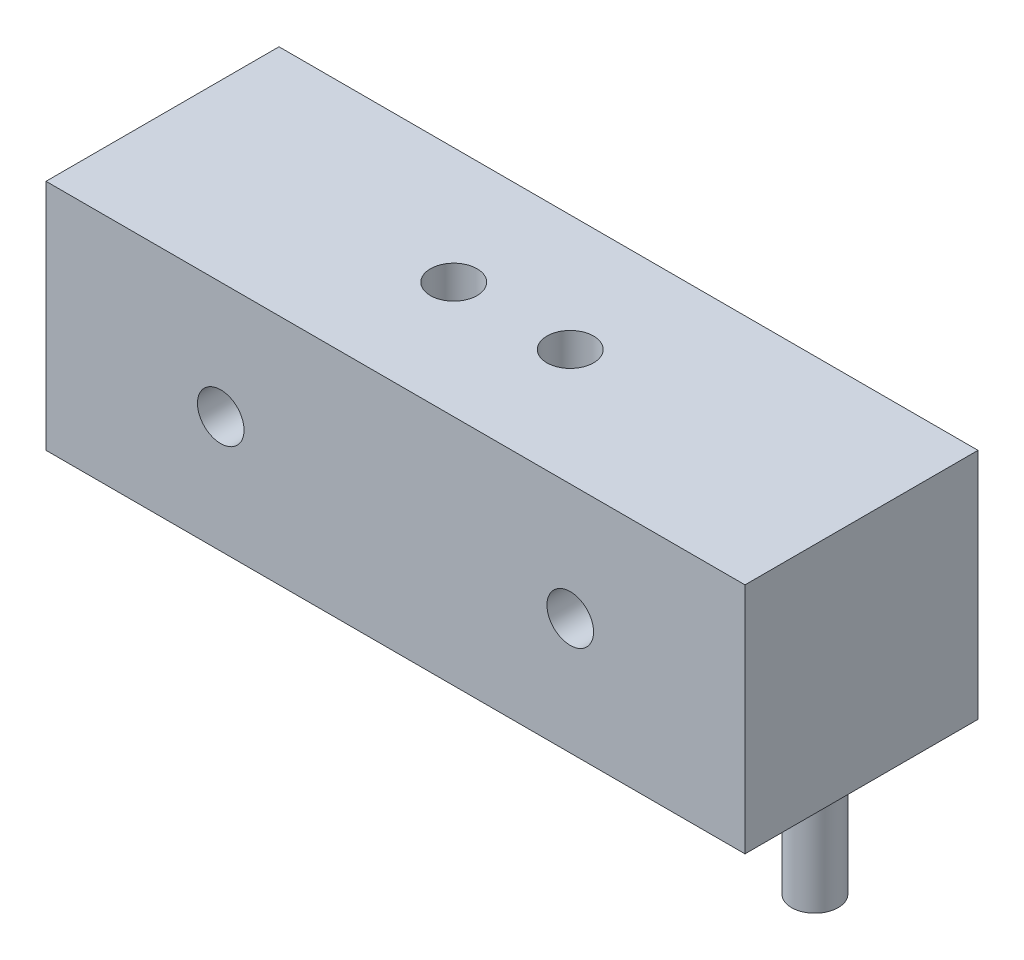
ISO-10303-21;
HEADER;
FILE_DESCRIPTION(('STEP AP214'),'2;1');
FILE_NAME('part.step','',(''),(''),'','','');
FILE_SCHEMA(('AUTOMOTIVE_DESIGN { 1 0 10303 214 1 1 1 1 }'));
ENDSEC;
DATA;
#1=APPLICATION_CONTEXT('core data for automotive mechanical design processes');
#2=APPLICATION_PROTOCOL_DEFINITION('international standard','automotive_design',2000,#1);
#3=PRODUCT_CONTEXT('',#1,'mechanical');
#4=PRODUCT('Part','Part','',(#3));
#5=PRODUCT_RELATED_PRODUCT_CATEGORY('part','',(#4));
#6=PRODUCT_DEFINITION_FORMATION('','',#4);
#7=PRODUCT_DEFINITION_CONTEXT('part definition',#1,'design');
#8=PRODUCT_DEFINITION('design','',#6,#7);
#9=PRODUCT_DEFINITION_SHAPE('','',#8);
#10=(LENGTH_UNIT() NAMED_UNIT(*) SI_UNIT(.MILLI.,.METRE.));
#11=(NAMED_UNIT(*) PLANE_ANGLE_UNIT() SI_UNIT($,.RADIAN.));
#12=(NAMED_UNIT(*) SI_UNIT($,.STERADIAN.) SOLID_ANGLE_UNIT());
#13=UNCERTAINTY_MEASURE_WITH_UNIT(LENGTH_MEASURE(1.E-05),#10,'distance_accuracy_value','');
#14=(GEOMETRIC_REPRESENTATION_CONTEXT(3) GLOBAL_UNCERTAINTY_ASSIGNED_CONTEXT((#13)) GLOBAL_UNIT_ASSIGNED_CONTEXT((#10,
#11,#12)) REPRESENTATION_CONTEXT('',''));
#15=CARTESIAN_POINT('',(0.,0.,0.));
#16=DIRECTION('',(0.,0.,1.));
#17=DIRECTION('',(1.,0.,0.));
#18=AXIS2_PLACEMENT_3D('',#15,#16,#17);
#19=CARTESIAN_POINT('',(-15.,5.,10.));
#20=DIRECTION('',(1.,0.,0.));
#21=DIRECTION('',(0.,1.,0.));
#22=AXIS2_PLACEMENT_3D('',#19,#20,#21);
#23=PLANE('',#22);
#24=DIRECTION('',(0.,-1.,0.));
#25=VECTOR('',#24,1.);
#26=CARTESIAN_POINT('',(-15.,5.,0.));
#27=LINE('',#26,#25);
#28=CARTESIAN_POINT('',(-15.,5.,0.));
#29=VERTEX_POINT('',#28);
#30=CARTESIAN_POINT('',(-15.,-5.,0.));
#31=VERTEX_POINT('',#30);
#32=EDGE_CURVE('E105',#29,#31,#27,.T.);
#33=ORIENTED_EDGE('',*,*,#32,.T.);
#34=DIRECTION('',(0.,0.,-1.));
#35=VECTOR('',#34,1.);
#36=CARTESIAN_POINT('',(-15.,-5.,10.));
#37=LINE('',#36,#35);
#38=CARTESIAN_POINT('',(-15.,-5.,10.));
#39=VERTEX_POINT('',#38);
#40=EDGE_CURVE('E47',#39,#31,#37,.T.);
#41=ORIENTED_EDGE('',*,*,#40,.F.);
#42=DIRECTION('',(0.,-1.,0.));
#43=VECTOR('',#42,1.);
#44=CARTESIAN_POINT('',(-15.,5.,10.));
#45=LINE('',#44,#43);
#46=CARTESIAN_POINT('',(-15.,5.,10.));
#47=VERTEX_POINT('',#46);
#48=EDGE_CURVE('E89',#47,#39,#45,.T.);
#49=ORIENTED_EDGE('',*,*,#48,.F.);
#50=DIRECTION('',(0.,0.,-1.));
#51=VECTOR('',#50,1.);
#52=CARTESIAN_POINT('',(-15.,5.,10.));
#53=LINE('',#52,#51);
#54=EDGE_CURVE('E55',#47,#29,#53,.T.);
#55=ORIENTED_EDGE('',*,*,#54,.T.);
#56=EDGE_LOOP('',(#33,#41,#49,#55));
#57=FACE_BOUND('',#56,.T.);
#58=ADVANCED_FACE('F39',(#57),#23,.F.);
#59=CARTESIAN_POINT('',(-15.,-5.,10.));
#60=DIRECTION('',(0.,1.,0.));
#61=DIRECTION('',(0.,0.,1.));
#62=AXIS2_PLACEMENT_3D('',#59,#60,#61);
#63=PLANE('',#62);
#64=CARTESIAN_POINT('',(13.,-5.,5.));
#65=DIRECTION('',(0.,1.,0.));
#66=DIRECTION('',(0.,0.,1.));
#67=AXIS2_PLACEMENT_3D('',#64,#65,#66);
#68=CIRCLE('',#67,1.);
#69=CARTESIAN_POINT('',(13.,-5.,6.));
#70=VERTEX_POINT('',#69);
#71=EDGE_CURVE('E11',#70,#70,#68,.F.);
#72=ORIENTED_EDGE('',*,*,#71,.F.);
#73=EDGE_LOOP('',(#72));
#74=FACE_BOUND('',#73,.T.);
#75=CARTESIAN_POINT('',(-2.5,-5.,5.));
#76=DIRECTION('',(0.,1.,0.));
#77=DIRECTION('',(0.,0.,1.));
#78=AXIS2_PLACEMENT_3D('',#75,#76,#77);
#79=CIRCLE('',#78,1.);
#80=CARTESIAN_POINT('',(-2.5,-5.,6.));
#81=VERTEX_POINT('',#80);
#82=EDGE_CURVE('E143',#81,#81,#79,.T.);
#83=ORIENTED_EDGE('',*,*,#82,.T.);
#84=EDGE_LOOP('',(#83));
#85=FACE_BOUND('',#84,.T.);
#86=CARTESIAN_POINT('',(2.5,-5.,5.));
#87=DIRECTION('',(0.,1.,0.));
#88=DIRECTION('',(0.,0.,1.));
#89=AXIS2_PLACEMENT_3D('',#86,#87,#88);
#90=CIRCLE('',#89,1.);
#91=CARTESIAN_POINT('',(2.5,-5.,6.));
#92=VERTEX_POINT('',#91);
#93=EDGE_CURVE('E146',#92,#92,#90,.T.);
#94=ORIENTED_EDGE('',*,*,#93,.T.);
#95=EDGE_LOOP('',(#94));
#96=FACE_BOUND('',#95,.T.);
#97=DIRECTION('',(1.,0.,0.));
#98=VECTOR('',#97,1.);
#99=CARTESIAN_POINT('',(-15.,-5.,0.));
#100=LINE('',#99,#98);
#101=CARTESIAN_POINT('',(15.,-5.,0.));
#102=VERTEX_POINT('',#101);
#103=EDGE_CURVE('E95',#31,#102,#100,.T.);
#104=ORIENTED_EDGE('',*,*,#103,.T.);
#105=DIRECTION('',(0.,0.,-1.));
#106=VECTOR('',#105,1.);
#107=CARTESIAN_POINT('',(15.,-5.,10.));
#108=LINE('',#107,#106);
#109=CARTESIAN_POINT('',(15.,-5.,10.));
#110=VERTEX_POINT('',#109);
#111=EDGE_CURVE('E93',#110,#102,#108,.T.);
#112=ORIENTED_EDGE('',*,*,#111,.F.);
#113=DIRECTION('',(1.,0.,0.));
#114=VECTOR('',#113,1.);
#115=CARTESIAN_POINT('',(-15.,-5.,10.));
#116=LINE('',#115,#114);
#117=EDGE_CURVE('E81',#39,#110,#116,.T.);
#118=ORIENTED_EDGE('',*,*,#117,.F.);
#119=ORIENTED_EDGE('',*,*,#40,.T.);
#120=EDGE_LOOP('',(#104,#112,#118,#119));
#121=FACE_BOUND('',#120,.T.);
#122=ADVANCED_FACE('F94',(#74,#85,#96,#121),#63,.F.);
#123=CARTESIAN_POINT('',(15.,5.,10.));
#124=DIRECTION('',(1.,0.,0.));
#125=DIRECTION('',(0.,1.,0.));
#126=AXIS2_PLACEMENT_3D('',#123,#124,#125);
#127=PLANE('',#126);
#128=DIRECTION('',(0.,-1.,0.));
#129=VECTOR('',#128,1.);
#130=CARTESIAN_POINT('',(15.,5.,0.));
#131=LINE('',#130,#129);
#132=CARTESIAN_POINT('',(15.,5.,0.));
#133=VERTEX_POINT('',#132);
#134=EDGE_CURVE('E109',#133,#102,#131,.T.);
#135=ORIENTED_EDGE('',*,*,#134,.F.);
#136=DIRECTION('',(0.,0.,-1.));
#137=VECTOR('',#136,1.);
#138=CARTESIAN_POINT('',(15.,5.,10.));
#139=LINE('',#138,#137);
#140=CARTESIAN_POINT('',(15.,5.,10.));
#141=VERTEX_POINT('',#140);
#142=EDGE_CURVE('E69',#141,#133,#139,.T.);
#143=ORIENTED_EDGE('',*,*,#142,.F.);
#144=DIRECTION('',(0.,-1.,0.));
#145=VECTOR('',#144,1.);
#146=CARTESIAN_POINT('',(15.,5.,10.));
#147=LINE('',#146,#145);
#148=EDGE_CURVE('E88',#141,#110,#147,.T.);
#149=ORIENTED_EDGE('',*,*,#148,.T.);
#150=ORIENTED_EDGE('',*,*,#111,.T.);
#151=EDGE_LOOP('',(#135,#143,#149,#150));
#152=FACE_BOUND('',#151,.T.);
#153=ADVANCED_FACE('F99',(#152),#127,.T.);
#154=CARTESIAN_POINT('',(-15.,5.,10.));
#155=DIRECTION('',(0.,1.,0.));
#156=DIRECTION('',(0.,0.,1.));
#157=AXIS2_PLACEMENT_3D('',#154,#155,#156);
#158=PLANE('',#157);
#159=CARTESIAN_POINT('',(-2.5,5.,5.));
#160=DIRECTION('',(0.,1.,0.));
#161=DIRECTION('',(0.,0.,1.));
#162=AXIS2_PLACEMENT_3D('',#159,#160,#161);
#163=CIRCLE('',#162,1.);
#164=CARTESIAN_POINT('',(-2.5,5.,6.));
#165=VERTEX_POINT('',#164);
#166=EDGE_CURVE('E152',#165,#165,#163,.T.);
#167=ORIENTED_EDGE('',*,*,#166,.F.);
#168=EDGE_LOOP('',(#167));
#169=FACE_BOUND('',#168,.T.);
#170=CARTESIAN_POINT('',(2.5,5.,5.));
#171=DIRECTION('',(0.,1.,0.));
#172=DIRECTION('',(0.,0.,1.));
#173=AXIS2_PLACEMENT_3D('',#170,#171,#172);
#174=CIRCLE('',#173,1.);
#175=CARTESIAN_POINT('',(2.5,5.,6.));
#176=VERTEX_POINT('',#175);
#177=EDGE_CURVE('E148',#176,#176,#174,.T.);
#178=ORIENTED_EDGE('',*,*,#177,.F.);
#179=EDGE_LOOP('',(#178));
#180=FACE_BOUND('',#179,.T.);
#181=DIRECTION('',(1.,0.,0.));
#182=VECTOR('',#181,1.);
#183=CARTESIAN_POINT('',(-15.,5.,0.));
#184=LINE('',#183,#182);
#185=EDGE_CURVE('E111',#29,#133,#184,.T.);
#186=ORIENTED_EDGE('',*,*,#185,.F.);
#187=ORIENTED_EDGE('',*,*,#54,.F.);
#188=DIRECTION('',(1.,0.,0.));
#189=VECTOR('',#188,1.);
#190=CARTESIAN_POINT('',(-15.,5.,10.));
#191=LINE('',#190,#189);
#192=EDGE_CURVE('E100',#47,#141,#191,.T.);
#193=ORIENTED_EDGE('',*,*,#192,.T.);
#194=ORIENTED_EDGE('',*,*,#142,.T.);
#195=EDGE_LOOP('',(#186,#187,#193,#194));
#196=FACE_BOUND('',#195,.T.);
#197=ADVANCED_FACE('F117',(#169,#180,#196),#158,.T.);
#198=CARTESIAN_POINT('',(0.,0.,10.));
#199=DIRECTION('',(0.,0.,1.));
#200=DIRECTION('',(1.,0.,0.));
#201=AXIS2_PLACEMENT_3D('',#198,#199,#200);
#202=PLANE('',#201);
#203=CARTESIAN_POINT('',(-7.5,0.,10.));
#204=DIRECTION('',(0.,0.,1.));
#205=DIRECTION('',(1.,0.,0.));
#206=AXIS2_PLACEMENT_3D('',#203,#204,#205);
#207=CIRCLE('',#206,1.);
#208=CARTESIAN_POINT('',(-6.5,0.,10.));
#209=VERTEX_POINT('',#208);
#210=EDGE_CURVE('E160',#209,#209,#207,.T.);
#211=ORIENTED_EDGE('',*,*,#210,.F.);
#212=EDGE_LOOP('',(#211));
#213=FACE_BOUND('',#212,.T.);
#214=CARTESIAN_POINT('',(7.5,0.,10.));
#215=DIRECTION('',(0.,0.,1.));
#216=DIRECTION('',(1.,0.,0.));
#217=AXIS2_PLACEMENT_3D('',#214,#215,#216);
#218=CIRCLE('',#217,1.);
#219=CARTESIAN_POINT('',(8.5,0.,10.));
#220=VERTEX_POINT('',#219);
#221=EDGE_CURVE('E163',#220,#220,#218,.T.);
#222=ORIENTED_EDGE('',*,*,#221,.F.);
#223=EDGE_LOOP('',(#222));
#224=FACE_BOUND('',#223,.T.);
#225=ORIENTED_EDGE('',*,*,#48,.T.);
#226=ORIENTED_EDGE('',*,*,#117,.T.);
#227=ORIENTED_EDGE('',*,*,#148,.F.);
#228=ORIENTED_EDGE('',*,*,#192,.F.);
#229=EDGE_LOOP('',(#225,#226,#227,#228));
#230=FACE_BOUND('',#229,.T.);
#231=ADVANCED_FACE('F85',(#213,#224,#230),#202,.T.);
#232=CARTESIAN_POINT('',(0.,0.,0.));
#233=DIRECTION('',(0.,0.,1.));
#234=DIRECTION('',(1.,0.,0.));
#235=AXIS2_PLACEMENT_3D('',#232,#233,#234);
#236=PLANE('',#235);
#237=CARTESIAN_POINT('',(-7.5,0.,0.));
#238=DIRECTION('',(0.,0.,1.));
#239=DIRECTION('',(1.,0.,0.));
#240=AXIS2_PLACEMENT_3D('',#237,#238,#239);
#241=CIRCLE('',#240,1.);
#242=CARTESIAN_POINT('',(-6.5,0.,0.));
#243=VERTEX_POINT('',#242);
#244=EDGE_CURVE('E107',#243,#243,#241,.T.);
#245=ORIENTED_EDGE('',*,*,#244,.T.);
#246=EDGE_LOOP('',(#245));
#247=FACE_BOUND('',#246,.T.);
#248=CARTESIAN_POINT('',(7.5,0.,0.));
#249=DIRECTION('',(0.,0.,1.));
#250=DIRECTION('',(1.,0.,0.));
#251=AXIS2_PLACEMENT_3D('',#248,#249,#250);
#252=CIRCLE('',#251,1.);
#253=CARTESIAN_POINT('',(8.5,0.,0.));
#254=VERTEX_POINT('',#253);
#255=EDGE_CURVE('E166',#254,#254,#252,.T.);
#256=ORIENTED_EDGE('',*,*,#255,.T.);
#257=EDGE_LOOP('',(#256));
#258=FACE_BOUND('',#257,.T.);
#259=ORIENTED_EDGE('',*,*,#32,.F.);
#260=ORIENTED_EDGE('',*,*,#185,.T.);
#261=ORIENTED_EDGE('',*,*,#134,.T.);
#262=ORIENTED_EDGE('',*,*,#103,.F.);
#263=EDGE_LOOP('',(#259,#260,#261,#262));
#264=FACE_BOUND('',#263,.T.);
#265=ADVANCED_FACE('F116',(#247,#258,#264),#236,.F.);
#266=CARTESIAN_POINT('',(7.5,0.,0.));
#267=DIRECTION('',(0.,0.,1.));
#268=DIRECTION('',(1.,0.,0.));
#269=AXIS2_PLACEMENT_3D('',#266,#267,#268);
#270=CYLINDRICAL_SURFACE('',#269,1.);
#271=ORIENTED_EDGE('',*,*,#255,.F.);
#272=EDGE_LOOP('',(#271));
#273=FACE_BOUND('',#272,.T.);
#274=ORIENTED_EDGE('',*,*,#221,.T.);
#275=EDGE_LOOP('',(#274));
#276=FACE_BOUND('',#275,.T.);
#277=ADVANCED_FACE('F192',(#273,#276),#270,.F.);
#278=CARTESIAN_POINT('',(-7.5,0.,0.));
#279=DIRECTION('',(0.,0.,1.));
#280=DIRECTION('',(1.,0.,0.));
#281=AXIS2_PLACEMENT_3D('',#278,#279,#280);
#282=CYLINDRICAL_SURFACE('',#281,1.);
#283=ORIENTED_EDGE('',*,*,#244,.F.);
#284=EDGE_LOOP('',(#283));
#285=FACE_BOUND('',#284,.T.);
#286=ORIENTED_EDGE('',*,*,#210,.T.);
#287=EDGE_LOOP('',(#286));
#288=FACE_BOUND('',#287,.T.);
#289=ADVANCED_FACE('F186',(#285,#288),#282,.F.);
#290=CARTESIAN_POINT('',(2.5,-5.,5.));
#291=DIRECTION('',(0.,1.,0.));
#292=DIRECTION('',(0.,0.,1.));
#293=AXIS2_PLACEMENT_3D('',#290,#291,#292);
#294=CYLINDRICAL_SURFACE('',#293,1.);
#295=ORIENTED_EDGE('',*,*,#93,.F.);
#296=EDGE_LOOP('',(#295));
#297=FACE_BOUND('',#296,.T.);
#298=ORIENTED_EDGE('',*,*,#177,.T.);
#299=EDGE_LOOP('',(#298));
#300=FACE_BOUND('',#299,.T.);
#301=ADVANCED_FACE('F176',(#297,#300),#294,.F.);
#302=CARTESIAN_POINT('',(-2.5,-5.,5.));
#303=DIRECTION('',(0.,1.,0.));
#304=DIRECTION('',(0.,0.,1.));
#305=AXIS2_PLACEMENT_3D('',#302,#303,#304);
#306=CYLINDRICAL_SURFACE('',#305,1.);
#307=ORIENTED_EDGE('',*,*,#82,.F.);
#308=EDGE_LOOP('',(#307));
#309=FACE_BOUND('',#308,.T.);
#310=ORIENTED_EDGE('',*,*,#166,.T.);
#311=EDGE_LOOP('',(#310));
#312=FACE_BOUND('',#311,.T.);
#313=ADVANCED_FACE('F173',(#309,#312),#306,.F.);
#314=CARTESIAN_POINT('',(13.,-10.,5.));
#315=DIRECTION('',(0.,1.,0.));
#316=DIRECTION('',(0.,0.,1.));
#317=AXIS2_PLACEMENT_3D('',#314,#315,#316);
#318=CYLINDRICAL_SURFACE('',#317,1.);
#319=CARTESIAN_POINT('',(13.,-10.,5.));
#320=DIRECTION('',(0.,-1.,0.));
#321=DIRECTION('',(0.,0.,-1.));
#322=AXIS2_PLACEMENT_3D('',#319,#320,#321);
#323=CIRCLE('',#322,1.);
#324=CARTESIAN_POINT('',(13.,-10.,4.));
#325=VERTEX_POINT('',#324);
#326=EDGE_CURVE('E149',#325,#325,#323,.T.);
#327=ORIENTED_EDGE('',*,*,#326,.F.);
#328=EDGE_LOOP('',(#327));
#329=FACE_BOUND('',#328,.T.);
#330=ORIENTED_EDGE('',*,*,#71,.T.);
#331=EDGE_LOOP('',(#330));
#332=FACE_BOUND('',#331,.T.);
#333=ADVANCED_FACE('F175',(#329,#332),#318,.T.);
#334=CARTESIAN_POINT('',(13.,-10.,5.));
#335=DIRECTION('',(0.,-1.,0.));
#336=DIRECTION('',(0.,0.,-1.));
#337=AXIS2_PLACEMENT_3D('',#334,#335,#336);
#338=PLANE('',#337);
#339=ORIENTED_EDGE('',*,*,#326,.T.);
#340=EDGE_LOOP('',(#339));
#341=FACE_BOUND('',#340,.T.);
#342=ADVANCED_FACE('F183',(#341),#338,.T.);
#343=CLOSED_SHELL('',(#58,#122,#153,#197,#231,#265,#277,#289,#301,#313,#333,#342));
#344=MANIFOLD_SOLID_BREP('B2',#343);
#345=ADVANCED_BREP_SHAPE_REPRESENTATION('',(#18,#344),#14);
#346=SHAPE_DEFINITION_REPRESENTATION(#9,#345);
ENDSEC;
END-ISO-10303-21;
